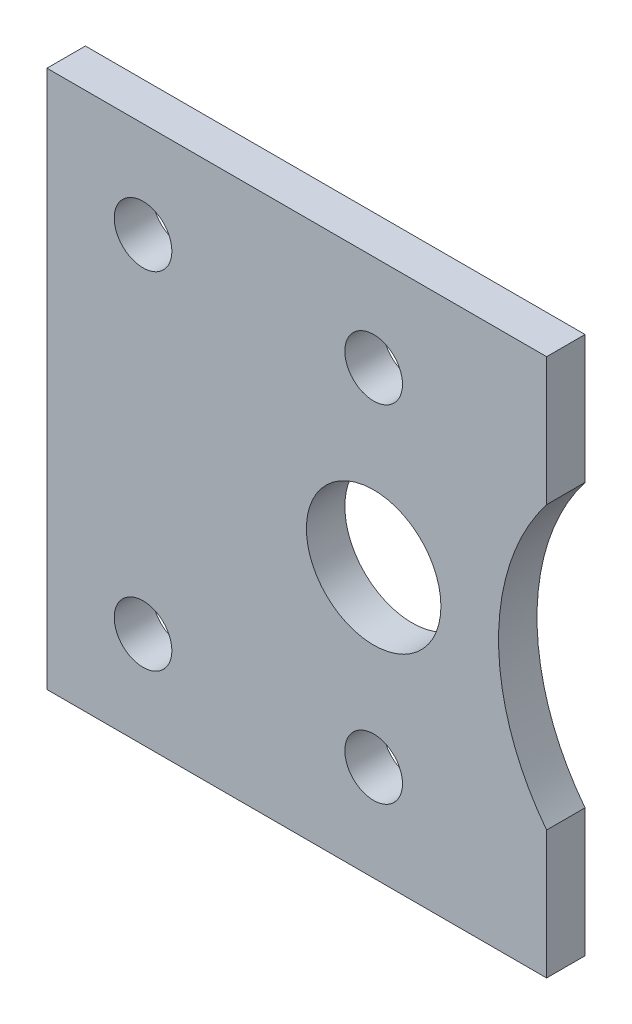
ISO-10303-21;
HEADER;
FILE_DESCRIPTION(('STEP AP214'),'2;1');
FILE_NAME('part.step','',(''),(''),'','','');
FILE_SCHEMA(('AUTOMOTIVE_DESIGN { 1 0 10303 214 1 1 1 1 }'));
ENDSEC;
DATA;
#1=APPLICATION_CONTEXT('core data for automotive mechanical design processes');
#2=APPLICATION_PROTOCOL_DEFINITION('international standard','automotive_design',2000,#1);
#3=PRODUCT_CONTEXT('',#1,'mechanical');
#4=PRODUCT('Part','Part','',(#3));
#5=PRODUCT_RELATED_PRODUCT_CATEGORY('part','',(#4));
#6=PRODUCT_DEFINITION_FORMATION('','',#4);
#7=PRODUCT_DEFINITION_CONTEXT('part definition',#1,'design');
#8=PRODUCT_DEFINITION('design','',#6,#7);
#9=PRODUCT_DEFINITION_SHAPE('','',#8);
#10=(LENGTH_UNIT() NAMED_UNIT(*) SI_UNIT(.MILLI.,.METRE.));
#11=(NAMED_UNIT(*) PLANE_ANGLE_UNIT() SI_UNIT($,.RADIAN.));
#12=(NAMED_UNIT(*) SI_UNIT($,.STERADIAN.) SOLID_ANGLE_UNIT());
#13=UNCERTAINTY_MEASURE_WITH_UNIT(LENGTH_MEASURE(1.E-05),#10,'distance_accuracy_value','');
#14=(GEOMETRIC_REPRESENTATION_CONTEXT(3) GLOBAL_UNCERTAINTY_ASSIGNED_CONTEXT((#13)) GLOBAL_UNIT_ASSIGNED_CONTEXT((#10,
#11,#12)) REPRESENTATION_CONTEXT('',''));
#15=CARTESIAN_POINT('',(0.,0.,0.));
#16=DIRECTION('',(0.,0.,1.));
#17=DIRECTION('',(1.,0.,0.));
#18=AXIS2_PLACEMENT_3D('',#15,#16,#17);
#19=CARTESIAN_POINT('',(18.5,0.,2.));
#20=DIRECTION('',(0.,0.,-1.));
#21=DIRECTION('',(-1.,0.,0.));
#22=AXIS2_PLACEMENT_3D('',#19,#20,#21);
#23=CYLINDRICAL_SURFACE('',#22,12.);
#24=CARTESIAN_POINT('',(18.5,0.,0.));
#25=DIRECTION('',(0.,0.,1.));
#26=DIRECTION('',(1.,0.,0.));
#27=AXIS2_PLACEMENT_3D('',#24,#25,#26);
#28=CIRCLE('',#27,12.);
#29=CARTESIAN_POINT('',(9.,7.33143914930759,0.));
#30=VERTEX_POINT('',#29);
#31=CARTESIAN_POINT('',(9.,-7.33143914930759,0.));
#32=VERTEX_POINT('',#31);
#33=EDGE_CURVE('E138',#30,#32,#28,.T.);
#34=ORIENTED_EDGE('',*,*,#33,.F.);
#35=DIRECTION('',(0.,0.,-1.));
#36=VECTOR('',#35,1.);
#37=CARTESIAN_POINT('',(9.,7.33143914930759,2.));
#38=LINE('',#37,#36);
#39=CARTESIAN_POINT('',(9.,7.33143914930759,2.));
#40=VERTEX_POINT('',#39);
#41=EDGE_CURVE('E11',#40,#30,#38,.T.);
#42=ORIENTED_EDGE('',*,*,#41,.F.);
#43=CARTESIAN_POINT('',(18.5,0.,2.));
#44=DIRECTION('',(0.,0.,1.));
#45=DIRECTION('',(1.,0.,0.));
#46=AXIS2_PLACEMENT_3D('',#43,#44,#45);
#47=CIRCLE('',#46,12.);
#48=CARTESIAN_POINT('',(9.,-7.33143914930759,2.));
#49=VERTEX_POINT('',#48);
#50=EDGE_CURVE('E166',#40,#49,#47,.T.);
#51=ORIENTED_EDGE('',*,*,#50,.T.);
#52=DIRECTION('',(0.,0.,-1.));
#53=VECTOR('',#52,1.);
#54=CARTESIAN_POINT('',(9.,-7.33143914930759,2.));
#55=LINE('',#54,#53);
#56=EDGE_CURVE('E56',#49,#32,#55,.T.);
#57=ORIENTED_EDGE('',*,*,#56,.T.);
#58=EDGE_LOOP('',(#34,#42,#51,#57));
#59=FACE_BOUND('',#58,.T.);
#60=ADVANCED_FACE('F43',(#59),#23,.F.);
#61=CARTESIAN_POINT('',(8.99999999999999,0.,2.));
#62=DIRECTION('',(1.,0.,0.));
#63=DIRECTION('',(0.,1.,0.));
#64=AXIS2_PLACEMENT_3D('',#61,#62,#63);
#65=PLANE('',#64);
#66=DIRECTION('',(0.,-1.,0.));
#67=VECTOR('',#66,1.);
#68=CARTESIAN_POINT('',(8.99999999999999,0.,0.));
#69=LINE('',#68,#67);
#70=CARTESIAN_POINT('',(9.,14.,0.));
#71=VERTEX_POINT('',#70);
#72=EDGE_CURVE('E142',#71,#30,#69,.T.);
#73=ORIENTED_EDGE('',*,*,#72,.F.);
#74=DIRECTION('',(0.,0.,-1.));
#75=VECTOR('',#74,1.);
#76=CARTESIAN_POINT('',(9.,14.,2.));
#77=LINE('',#76,#75);
#78=CARTESIAN_POINT('',(9.,14.,2.));
#79=VERTEX_POINT('',#78);
#80=EDGE_CURVE('E51',#79,#71,#77,.T.);
#81=ORIENTED_EDGE('',*,*,#80,.F.);
#82=DIRECTION('',(0.,-1.,0.));
#83=VECTOR('',#82,1.);
#84=CARTESIAN_POINT('',(8.99999999999999,0.,2.));
#85=LINE('',#84,#83);
#86=EDGE_CURVE('E321',#79,#40,#85,.T.);
#87=ORIENTED_EDGE('',*,*,#86,.T.);
#88=ORIENTED_EDGE('',*,*,#41,.T.);
#89=EDGE_LOOP('',(#73,#81,#87,#88));
#90=FACE_BOUND('',#89,.T.);
#91=ADVANCED_FACE('F179',(#90),#65,.T.);
#92=CARTESIAN_POINT('',(0.,14.,2.));
#93=DIRECTION('',(0.,1.,0.));
#94=DIRECTION('',(-1.,0.,0.));
#95=AXIS2_PLACEMENT_3D('',#92,#93,#94);
#96=PLANE('',#95);
#97=DIRECTION('',(1.,0.,0.));
#98=VECTOR('',#97,1.);
#99=CARTESIAN_POINT('',(0.,14.,0.));
#100=LINE('',#99,#98);
#101=CARTESIAN_POINT('',(-17.,14.,0.));
#102=VERTEX_POINT('',#101);
#103=EDGE_CURVE('E144',#102,#71,#100,.T.);
#104=ORIENTED_EDGE('',*,*,#103,.F.);
#105=DIRECTION('',(0.,0.,-1.));
#106=VECTOR('',#105,1.);
#107=CARTESIAN_POINT('',(-17.,14.,2.));
#108=LINE('',#107,#106);
#109=CARTESIAN_POINT('',(-17.,14.,2.));
#110=VERTEX_POINT('',#109);
#111=EDGE_CURVE('E106',#110,#102,#108,.T.);
#112=ORIENTED_EDGE('',*,*,#111,.F.);
#113=DIRECTION('',(1.,0.,0.));
#114=VECTOR('',#113,1.);
#115=CARTESIAN_POINT('',(0.,14.,2.));
#116=LINE('',#115,#114);
#117=EDGE_CURVE('E120',#110,#79,#116,.T.);
#118=ORIENTED_EDGE('',*,*,#117,.T.);
#119=ORIENTED_EDGE('',*,*,#80,.T.);
#120=EDGE_LOOP('',(#104,#112,#118,#119));
#121=FACE_BOUND('',#120,.T.);
#122=ADVANCED_FACE('F173',(#121),#96,.T.);
#123=CARTESIAN_POINT('',(-17.,0.,2.));
#124=DIRECTION('',(-1.,0.,0.));
#125=DIRECTION('',(0.,0.,1.));
#126=AXIS2_PLACEMENT_3D('',#123,#124,#125);
#127=PLANE('',#126);
#128=DIRECTION('',(0.,1.,0.));
#129=VECTOR('',#128,1.);
#130=CARTESIAN_POINT('',(-17.,0.,0.));
#131=LINE('',#130,#129);
#132=CARTESIAN_POINT('',(-17.,-14.,0.));
#133=VERTEX_POINT('',#132);
#134=EDGE_CURVE('E105',#133,#102,#131,.T.);
#135=ORIENTED_EDGE('',*,*,#134,.F.);
#136=DIRECTION('',(0.,0.,-1.));
#137=VECTOR('',#136,1.);
#138=CARTESIAN_POINT('',(-17.,-14.,2.));
#139=LINE('',#138,#137);
#140=CARTESIAN_POINT('',(-17.,-14.,2.));
#141=VERTEX_POINT('',#140);
#142=EDGE_CURVE('E100',#141,#133,#139,.T.);
#143=ORIENTED_EDGE('',*,*,#142,.F.);
#144=DIRECTION('',(0.,1.,0.));
#145=VECTOR('',#144,1.);
#146=CARTESIAN_POINT('',(-17.,0.,2.));
#147=LINE('',#146,#145);
#148=EDGE_CURVE('E99',#141,#110,#147,.T.);
#149=ORIENTED_EDGE('',*,*,#148,.T.);
#150=ORIENTED_EDGE('',*,*,#111,.T.);
#151=EDGE_LOOP('',(#135,#143,#149,#150));
#152=FACE_BOUND('',#151,.T.);
#153=ADVANCED_FACE('F97',(#152),#127,.T.);
#154=CARTESIAN_POINT('',(0.,-14.,2.));
#155=DIRECTION('',(0.,-1.,0.));
#156=DIRECTION('',(1.,0.,0.));
#157=AXIS2_PLACEMENT_3D('',#154,#155,#156);
#158=PLANE('',#157);
#159=DIRECTION('',(-1.,0.,0.));
#160=VECTOR('',#159,1.);
#161=CARTESIAN_POINT('',(0.,-14.,0.));
#162=LINE('',#161,#160);
#163=CARTESIAN_POINT('',(9.,-14.,0.));
#164=VERTEX_POINT('',#163);
#165=EDGE_CURVE('E149',#164,#133,#162,.T.);
#166=ORIENTED_EDGE('',*,*,#165,.F.);
#167=DIRECTION('',(0.,0.,-1.));
#168=VECTOR('',#167,1.);
#169=CARTESIAN_POINT('',(9.,-14.,2.));
#170=LINE('',#169,#168);
#171=CARTESIAN_POINT('',(9.,-14.,2.));
#172=VERTEX_POINT('',#171);
#173=EDGE_CURVE('E79',#172,#164,#170,.T.);
#174=ORIENTED_EDGE('',*,*,#173,.F.);
#175=DIRECTION('',(-1.,0.,0.));
#176=VECTOR('',#175,1.);
#177=CARTESIAN_POINT('',(0.,-14.,2.));
#178=LINE('',#177,#176);
#179=EDGE_CURVE('E111',#172,#141,#178,.T.);
#180=ORIENTED_EDGE('',*,*,#179,.T.);
#181=ORIENTED_EDGE('',*,*,#142,.T.);
#182=EDGE_LOOP('',(#166,#174,#180,#181));
#183=FACE_BOUND('',#182,.T.);
#184=ADVANCED_FACE('F116',(#183),#158,.T.);
#185=CARTESIAN_POINT('',(0.,0.,2.));
#186=DIRECTION('',(0.,0.,-1.));
#187=DIRECTION('',(-1.,0.,0.));
#188=AXIS2_PLACEMENT_3D('',#185,#186,#187);
#189=CYLINDRICAL_SURFACE('',#188,3.5);
#190=CARTESIAN_POINT('',(0.,0.,2.));
#191=DIRECTION('',(0.,0.,1.));
#192=DIRECTION('',(1.,0.,0.));
#193=AXIS2_PLACEMENT_3D('',#190,#191,#192);
#194=CIRCLE('',#193,3.5);
#195=CARTESIAN_POINT('',(3.5,0.,2.));
#196=VERTEX_POINT('',#195);
#197=EDGE_CURVE('E131',#196,#196,#194,.T.);
#198=ORIENTED_EDGE('',*,*,#197,.T.);
#199=EDGE_LOOP('',(#198));
#200=FACE_BOUND('',#199,.T.);
#201=CARTESIAN_POINT('',(0.,0.,0.));
#202=DIRECTION('',(0.,0.,1.));
#203=DIRECTION('',(1.,0.,0.));
#204=AXIS2_PLACEMENT_3D('',#201,#202,#203);
#205=CIRCLE('',#204,3.5);
#206=CARTESIAN_POINT('',(3.5,0.,0.));
#207=VERTEX_POINT('',#206);
#208=EDGE_CURVE('E162',#207,#207,#205,.T.);
#209=ORIENTED_EDGE('',*,*,#208,.F.);
#210=EDGE_LOOP('',(#209));
#211=FACE_BOUND('',#210,.T.);
#212=ADVANCED_FACE('F208',(#200,#211),#189,.F.);
#213=CARTESIAN_POINT('',(0.,-8.99999999999999,2.));
#214=DIRECTION('',(0.,0.,-1.));
#215=DIRECTION('',(-1.,0.,0.));
#216=AXIS2_PLACEMENT_3D('',#213,#214,#215);
#217=CYLINDRICAL_SURFACE('',#216,1.5);
#218=CARTESIAN_POINT('',(0.,-8.99999999999999,2.));
#219=DIRECTION('',(0.,0.,1.));
#220=DIRECTION('',(1.,0.,0.));
#221=AXIS2_PLACEMENT_3D('',#218,#219,#220);
#222=CIRCLE('',#221,1.5);
#223=CARTESIAN_POINT('',(1.5,-8.99999999999999,2.));
#224=VERTEX_POINT('',#223);
#225=EDGE_CURVE('E132',#224,#224,#222,.T.);
#226=ORIENTED_EDGE('',*,*,#225,.T.);
#227=EDGE_LOOP('',(#226));
#228=FACE_BOUND('',#227,.T.);
#229=CARTESIAN_POINT('',(0.,-8.99999999999999,0.));
#230=DIRECTION('',(0.,0.,1.));
#231=DIRECTION('',(1.,0.,0.));
#232=AXIS2_PLACEMENT_3D('',#229,#230,#231);
#233=CIRCLE('',#232,1.5);
#234=CARTESIAN_POINT('',(1.5,-8.99999999999999,0.));
#235=VERTEX_POINT('',#234);
#236=EDGE_CURVE('E159',#235,#235,#233,.T.);
#237=ORIENTED_EDGE('',*,*,#236,.F.);
#238=EDGE_LOOP('',(#237));
#239=FACE_BOUND('',#238,.T.);
#240=ADVANCED_FACE('F215',(#228,#239),#217,.F.);
#241=CARTESIAN_POINT('',(-12.,-8.99999999999999,2.));
#242=DIRECTION('',(0.,0.,-1.));
#243=DIRECTION('',(-1.,0.,0.));
#244=AXIS2_PLACEMENT_3D('',#241,#242,#243);
#245=CYLINDRICAL_SURFACE('',#244,1.5);
#246=CARTESIAN_POINT('',(-12.,-8.99999999999999,2.));
#247=DIRECTION('',(0.,0.,1.));
#248=DIRECTION('',(1.,0.,0.));
#249=AXIS2_PLACEMENT_3D('',#246,#247,#248);
#250=CIRCLE('',#249,1.5);
#251=CARTESIAN_POINT('',(-10.5,-8.99999999999999,2.));
#252=VERTEX_POINT('',#251);
#253=EDGE_CURVE('E126',#252,#252,#250,.T.);
#254=ORIENTED_EDGE('',*,*,#253,.T.);
#255=EDGE_LOOP('',(#254));
#256=FACE_BOUND('',#255,.T.);
#257=CARTESIAN_POINT('',(-12.,-8.99999999999999,0.));
#258=DIRECTION('',(0.,0.,1.));
#259=DIRECTION('',(1.,0.,0.));
#260=AXIS2_PLACEMENT_3D('',#257,#258,#259);
#261=CIRCLE('',#260,1.5);
#262=CARTESIAN_POINT('',(-10.5,-8.99999999999999,0.));
#263=VERTEX_POINT('',#262);
#264=EDGE_CURVE('E160',#263,#263,#261,.T.);
#265=ORIENTED_EDGE('',*,*,#264,.F.);
#266=EDGE_LOOP('',(#265));
#267=FACE_BOUND('',#266,.T.);
#268=ADVANCED_FACE('F194',(#256,#267),#245,.F.);
#269=CARTESIAN_POINT('',(-12.,8.99999999999999,2.));
#270=DIRECTION('',(0.,0.,-1.));
#271=DIRECTION('',(-1.,0.,0.));
#272=AXIS2_PLACEMENT_3D('',#269,#270,#271);
#273=CYLINDRICAL_SURFACE('',#272,1.5);
#274=CARTESIAN_POINT('',(-12.,8.99999999999999,2.));
#275=DIRECTION('',(0.,0.,1.));
#276=DIRECTION('',(1.,0.,0.));
#277=AXIS2_PLACEMENT_3D('',#274,#275,#276);
#278=CIRCLE('',#277,1.5);
#279=CARTESIAN_POINT('',(-10.5,8.99999999999999,2.));
#280=VERTEX_POINT('',#279);
#281=EDGE_CURVE('E125',#280,#280,#278,.F.);
#282=ORIENTED_EDGE('',*,*,#281,.F.);
#283=EDGE_LOOP('',(#282));
#284=FACE_BOUND('',#283,.T.);
#285=CARTESIAN_POINT('',(-12.,8.99999999999999,0.));
#286=DIRECTION('',(0.,0.,1.));
#287=DIRECTION('',(1.,0.,0.));
#288=AXIS2_PLACEMENT_3D('',#285,#286,#287);
#289=CIRCLE('',#288,1.5);
#290=CARTESIAN_POINT('',(-10.5,8.99999999999999,0.));
#291=VERTEX_POINT('',#290);
#292=EDGE_CURVE('E152',#291,#291,#289,.F.);
#293=ORIENTED_EDGE('',*,*,#292,.T.);
#294=EDGE_LOOP('',(#293));
#295=FACE_BOUND('',#294,.T.);
#296=ADVANCED_FACE('F183',(#284,#295),#273,.F.);
#297=CARTESIAN_POINT('',(8.99999999999999,0.,2.));
#298=DIRECTION('',(1.,0.,0.));
#299=DIRECTION('',(0.,1.,0.));
#300=AXIS2_PLACEMENT_3D('',#297,#298,#299);
#301=PLANE('',#300);
#302=DIRECTION('',(0.,-1.,0.));
#303=VECTOR('',#302,1.);
#304=CARTESIAN_POINT('',(8.99999999999999,0.,0.));
#305=LINE('',#304,#303);
#306=EDGE_CURVE('E151',#32,#164,#305,.T.);
#307=ORIENTED_EDGE('',*,*,#306,.F.);
#308=ORIENTED_EDGE('',*,*,#56,.F.);
#309=DIRECTION('',(0.,-1.,0.));
#310=VECTOR('',#309,1.);
#311=CARTESIAN_POINT('',(8.99999999999999,0.,2.));
#312=LINE('',#311,#310);
#313=EDGE_CURVE('E118',#49,#172,#312,.T.);
#314=ORIENTED_EDGE('',*,*,#313,.T.);
#315=ORIENTED_EDGE('',*,*,#173,.T.);
#316=EDGE_LOOP('',(#307,#308,#314,#315));
#317=FACE_BOUND('',#316,.T.);
#318=ADVANCED_FACE('F185',(#317),#301,.T.);
#319=CARTESIAN_POINT('',(0.,8.99999999999999,2.));
#320=DIRECTION('',(0.,0.,-1.));
#321=DIRECTION('',(-1.,0.,0.));
#322=AXIS2_PLACEMENT_3D('',#319,#320,#321);
#323=CYLINDRICAL_SURFACE('',#322,1.5);
#324=CARTESIAN_POINT('',(0.,8.99999999999999,2.));
#325=DIRECTION('',(0.,0.,1.));
#326=DIRECTION('',(1.,0.,0.));
#327=AXIS2_PLACEMENT_3D('',#324,#325,#326);
#328=CIRCLE('',#327,1.5);
#329=CARTESIAN_POINT('',(1.5,8.99999999999999,2.));
#330=VERTEX_POINT('',#329);
#331=EDGE_CURVE('E140',#330,#330,#328,.F.);
#332=ORIENTED_EDGE('',*,*,#331,.F.);
#333=EDGE_LOOP('',(#332));
#334=FACE_BOUND('',#333,.T.);
#335=CARTESIAN_POINT('',(0.,8.99999999999999,0.));
#336=DIRECTION('',(0.,0.,1.));
#337=DIRECTION('',(1.,0.,0.));
#338=AXIS2_PLACEMENT_3D('',#335,#336,#337);
#339=CIRCLE('',#338,1.5);
#340=CARTESIAN_POINT('',(1.5,8.99999999999999,0.));
#341=VERTEX_POINT('',#340);
#342=EDGE_CURVE('E167',#341,#341,#339,.F.);
#343=ORIENTED_EDGE('',*,*,#342,.T.);
#344=EDGE_LOOP('',(#343));
#345=FACE_BOUND('',#344,.T.);
#346=ADVANCED_FACE('F184',(#334,#345),#323,.F.);
#347=CARTESIAN_POINT('',(0.,0.,2.));
#348=DIRECTION('',(0.,0.,1.));
#349=DIRECTION('',(1.,0.,0.));
#350=AXIS2_PLACEMENT_3D('',#347,#348,#349);
#351=PLANE('',#350);
#352=ORIENTED_EDGE('',*,*,#50,.F.);
#353=ORIENTED_EDGE('',*,*,#86,.F.);
#354=ORIENTED_EDGE('',*,*,#117,.F.);
#355=ORIENTED_EDGE('',*,*,#148,.F.);
#356=ORIENTED_EDGE('',*,*,#179,.F.);
#357=ORIENTED_EDGE('',*,*,#313,.F.);
#358=EDGE_LOOP('',(#352,#353,#354,#355,#356,#357));
#359=FACE_BOUND('',#358,.T.);
#360=ORIENTED_EDGE('',*,*,#281,.T.);
#361=EDGE_LOOP('',(#360));
#362=FACE_BOUND('',#361,.T.);
#363=ORIENTED_EDGE('',*,*,#253,.F.);
#364=EDGE_LOOP('',(#363));
#365=FACE_BOUND('',#364,.T.);
#366=ORIENTED_EDGE('',*,*,#225,.F.);
#367=EDGE_LOOP('',(#366));
#368=FACE_BOUND('',#367,.T.);
#369=ORIENTED_EDGE('',*,*,#197,.F.);
#370=EDGE_LOOP('',(#369));
#371=FACE_BOUND('',#370,.T.);
#372=ORIENTED_EDGE('',*,*,#331,.T.);
#373=EDGE_LOOP('',(#372));
#374=FACE_BOUND('',#373,.T.);
#375=ADVANCED_FACE('F112',(#359,#362,#365,#368,#371,#374),#351,.T.);
#376=CARTESIAN_POINT('',(0.,0.,0.));
#377=DIRECTION('',(0.,0.,1.));
#378=DIRECTION('',(1.,0.,0.));
#379=AXIS2_PLACEMENT_3D('',#376,#377,#378);
#380=PLANE('',#379);
#381=ORIENTED_EDGE('',*,*,#33,.T.);
#382=ORIENTED_EDGE('',*,*,#306,.T.);
#383=ORIENTED_EDGE('',*,*,#165,.T.);
#384=ORIENTED_EDGE('',*,*,#134,.T.);
#385=ORIENTED_EDGE('',*,*,#103,.T.);
#386=ORIENTED_EDGE('',*,*,#72,.T.);
#387=EDGE_LOOP('',(#381,#382,#383,#384,#385,#386));
#388=FACE_BOUND('',#387,.T.);
#389=ORIENTED_EDGE('',*,*,#292,.F.);
#390=EDGE_LOOP('',(#389));
#391=FACE_BOUND('',#390,.T.);
#392=ORIENTED_EDGE('',*,*,#264,.T.);
#393=EDGE_LOOP('',(#392));
#394=FACE_BOUND('',#393,.T.);
#395=ORIENTED_EDGE('',*,*,#236,.T.);
#396=EDGE_LOOP('',(#395));
#397=FACE_BOUND('',#396,.T.);
#398=ORIENTED_EDGE('',*,*,#208,.T.);
#399=EDGE_LOOP('',(#398));
#400=FACE_BOUND('',#399,.T.);
#401=ORIENTED_EDGE('',*,*,#342,.F.);
#402=EDGE_LOOP('',(#401));
#403=FACE_BOUND('',#402,.T.);
#404=ADVANCED_FACE('F178',(#388,#391,#394,#397,#400,#403),#380,.F.);
#405=CLOSED_SHELL('',(#60,#91,#122,#153,#184,#212,#240,#268,#296,#318,#346,#375,#404));
#406=MANIFOLD_SOLID_BREP('B2',#405);
#407=ADVANCED_BREP_SHAPE_REPRESENTATION('',(#18,#406),#14);
#408=SHAPE_DEFINITION_REPRESENTATION(#9,#407);
ENDSEC;
END-ISO-10303-21;
